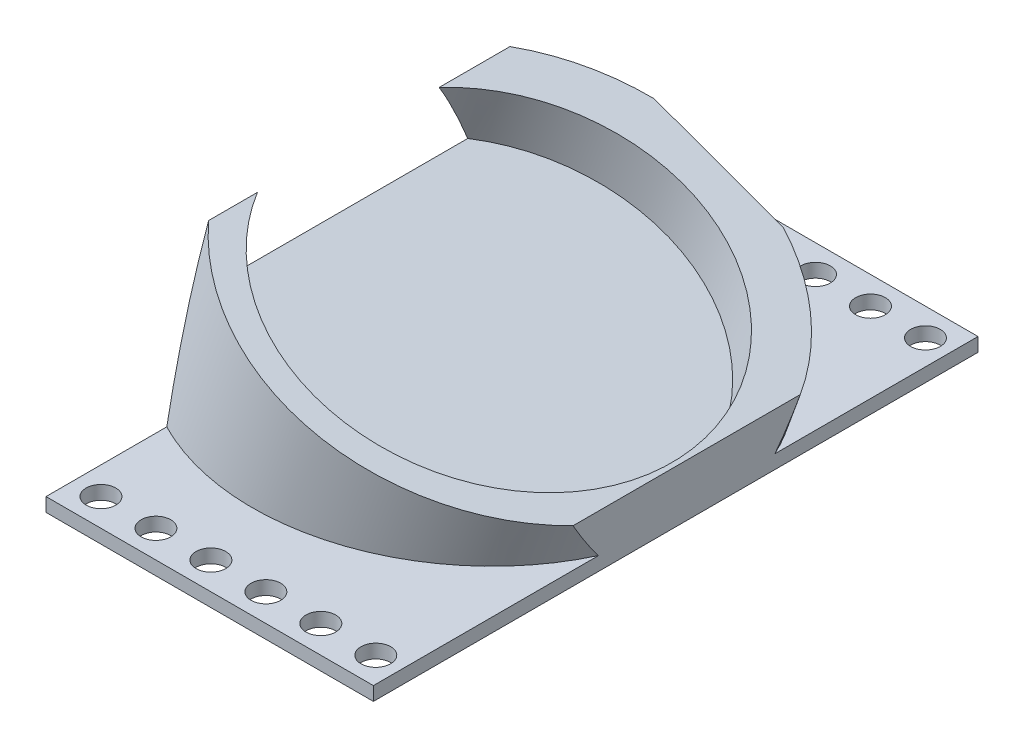
ISO-10303-21;
HEADER;
FILE_DESCRIPTION(('STEP AP214'),'2;1');
FILE_NAME('part.step','',(''),(''),'','','');
FILE_SCHEMA(('AUTOMOTIVE_DESIGN { 1 0 10303 214 1 1 1 1 }'));
ENDSEC;
DATA;
#1=APPLICATION_CONTEXT('core data for automotive mechanical design processes');
#2=APPLICATION_PROTOCOL_DEFINITION('international standard','automotive_design',2000,#1);
#3=PRODUCT_CONTEXT('',#1,'mechanical');
#4=PRODUCT('Part','Part','',(#3));
#5=PRODUCT_RELATED_PRODUCT_CATEGORY('part','',(#4));
#6=PRODUCT_DEFINITION_FORMATION('','',#4);
#7=PRODUCT_DEFINITION_CONTEXT('part definition',#1,'design');
#8=PRODUCT_DEFINITION('design','',#6,#7);
#9=PRODUCT_DEFINITION_SHAPE('','',#8);
#10=(LENGTH_UNIT() NAMED_UNIT(*) SI_UNIT(.MILLI.,.METRE.));
#11=(NAMED_UNIT(*) PLANE_ANGLE_UNIT() SI_UNIT($,.RADIAN.));
#12=(NAMED_UNIT(*) SI_UNIT($,.STERADIAN.) SOLID_ANGLE_UNIT());
#13=UNCERTAINTY_MEASURE_WITH_UNIT(LENGTH_MEASURE(1.E-05),#10,'distance_accuracy_value','');
#14=(GEOMETRIC_REPRESENTATION_CONTEXT(3) GLOBAL_UNCERTAINTY_ASSIGNED_CONTEXT((#13)) GLOBAL_UNIT_ASSIGNED_CONTEXT((#10,
#11,#12)) REPRESENTATION_CONTEXT('',''));
#15=CARTESIAN_POINT('',(0.,0.,0.));
#16=DIRECTION('',(0.,0.,1.));
#17=DIRECTION('',(1.,0.,0.));
#18=AXIS2_PLACEMENT_3D('',#15,#16,#17);
#19=CARTESIAN_POINT('',(0.,-58.42,0.));
#20=DIRECTION('',(0.,-1.,0.));
#21=DIRECTION('',(0.,0.,-1.));
#22=AXIS2_PLACEMENT_3D('',#19,#20,#21);
#23=PLANE('',#22);
#24=CARTESIAN_POINT('',(-38.9497353567698,-58.42,-63.5));
#25=DIRECTION('',(0.,-1.,0.));
#26=DIRECTION('',(0.,0.,-1.));
#27=AXIS2_PLACEMENT_3D('',#24,#25,#26);
#28=CIRCLE('',#27,3.42900000000001);
#29=CARTESIAN_POINT('',(-38.9497353567698,-58.42,-66.929));
#30=VERTEX_POINT('',#29);
#31=EDGE_CURVE('E133',#30,#30,#28,.T.);
#32=ORIENTED_EDGE('',*,*,#31,.F.);
#33=EDGE_LOOP('',(#32));
#34=FACE_BOUND('',#33,.T.);
#35=CARTESIAN_POINT('',(24.5502646432302,-58.42,-63.5));
#36=DIRECTION('',(0.,-1.,0.));
#37=DIRECTION('',(0.,0.,-1.));
#38=AXIS2_PLACEMENT_3D('',#35,#36,#37);
#39=CIRCLE('',#38,3.42900000000001);
#40=CARTESIAN_POINT('',(24.5502646432302,-58.42,-66.929));
#41=VERTEX_POINT('',#40);
#42=EDGE_CURVE('E290',#41,#41,#39,.T.);
#43=ORIENTED_EDGE('',*,*,#42,.F.);
#44=EDGE_LOOP('',(#43));
#45=FACE_BOUND('',#44,.T.);
#46=CARTESIAN_POINT('',(11.8502646432302,-58.42,-63.5));
#47=DIRECTION('',(0.,-1.,0.));
#48=DIRECTION('',(0.,0.,-1.));
#49=AXIS2_PLACEMENT_3D('',#46,#47,#48);
#50=CIRCLE('',#49,3.42900000000001);
#51=CARTESIAN_POINT('',(11.8502646432302,-58.42,-66.929));
#52=VERTEX_POINT('',#51);
#53=EDGE_CURVE('E296',#52,#52,#50,.T.);
#54=ORIENTED_EDGE('',*,*,#53,.F.);
#55=EDGE_LOOP('',(#54));
#56=FACE_BOUND('',#55,.T.);
#57=CARTESIAN_POINT('',(-0.849735356769764,-58.42,-63.5));
#58=DIRECTION('',(0.,-1.,0.));
#59=DIRECTION('',(0.,0.,-1.));
#60=AXIS2_PLACEMENT_3D('',#57,#58,#59);
#61=CIRCLE('',#60,3.42900000000001);
#62=CARTESIAN_POINT('',(-0.849735356769764,-58.42,-66.929));
#63=VERTEX_POINT('',#62);
#64=EDGE_CURVE('E302',#63,#63,#61,.T.);
#65=ORIENTED_EDGE('',*,*,#64,.F.);
#66=EDGE_LOOP('',(#65));
#67=FACE_BOUND('',#66,.T.);
#68=CARTESIAN_POINT('',(-13.5497353567698,-58.42,-63.5));
#69=DIRECTION('',(0.,-1.,0.));
#70=DIRECTION('',(0.,0.,-1.));
#71=AXIS2_PLACEMENT_3D('',#68,#69,#70);
#72=CIRCLE('',#71,3.42900000000001);
#73=CARTESIAN_POINT('',(-13.5497353567698,-58.42,-66.929));
#74=VERTEX_POINT('',#73);
#75=EDGE_CURVE('E308',#74,#74,#72,.T.);
#76=ORIENTED_EDGE('',*,*,#75,.F.);
#77=EDGE_LOOP('',(#76));
#78=FACE_BOUND('',#77,.T.);
#79=CARTESIAN_POINT('',(-26.2497353567698,-58.42,-63.5));
#80=DIRECTION('',(0.,-1.,0.));
#81=DIRECTION('',(0.,0.,-1.));
#82=AXIS2_PLACEMENT_3D('',#79,#80,#81);
#83=CIRCLE('',#82,3.42900000000002);
#84=CARTESIAN_POINT('',(-26.2497353567698,-58.42,-66.929));
#85=VERTEX_POINT('',#84);
#86=EDGE_CURVE('E314',#85,#85,#83,.T.);
#87=ORIENTED_EDGE('',*,*,#86,.F.);
#88=EDGE_LOOP('',(#87));
#89=FACE_BOUND('',#88,.T.);
#90=CARTESIAN_POINT('',(24.5502646432289,-58.42,63.5));
#91=DIRECTION('',(0.,-1.,0.));
#92=DIRECTION('',(0.,0.,-1.));
#93=AXIS2_PLACEMENT_3D('',#90,#91,#92);
#94=CIRCLE('',#93,3.42900000000001);
#95=CARTESIAN_POINT('',(24.5502646432289,-58.42,60.071));
#96=VERTEX_POINT('',#95);
#97=EDGE_CURVE('E320',#96,#96,#94,.T.);
#98=ORIENTED_EDGE('',*,*,#97,.F.);
#99=EDGE_LOOP('',(#98));
#100=FACE_BOUND('',#99,.T.);
#101=CARTESIAN_POINT('',(11.8502646432289,-58.42,63.5));
#102=DIRECTION('',(0.,-1.,0.));
#103=DIRECTION('',(0.,0.,-1.));
#104=AXIS2_PLACEMENT_3D('',#101,#102,#103);
#105=CIRCLE('',#104,3.42900000000001);
#106=CARTESIAN_POINT('',(11.8502646432289,-58.42,60.071));
#107=VERTEX_POINT('',#106);
#108=EDGE_CURVE('E326',#107,#107,#105,.T.);
#109=ORIENTED_EDGE('',*,*,#108,.F.);
#110=EDGE_LOOP('',(#109));
#111=FACE_BOUND('',#110,.T.);
#112=CARTESIAN_POINT('',(-0.849735356771096,-58.42,63.5));
#113=DIRECTION('',(0.,-1.,0.));
#114=DIRECTION('',(0.,0.,-1.));
#115=AXIS2_PLACEMENT_3D('',#112,#113,#114);
#116=CIRCLE('',#115,3.42900000000001);
#117=CARTESIAN_POINT('',(-0.849735356771096,-58.42,60.071));
#118=VERTEX_POINT('',#117);
#119=EDGE_CURVE('E332',#118,#118,#116,.T.);
#120=ORIENTED_EDGE('',*,*,#119,.F.);
#121=EDGE_LOOP('',(#120));
#122=FACE_BOUND('',#121,.T.);
#123=CARTESIAN_POINT('',(-13.5497353567711,-58.42,63.5));
#124=DIRECTION('',(0.,-1.,0.));
#125=DIRECTION('',(0.,0.,-1.));
#126=AXIS2_PLACEMENT_3D('',#123,#124,#125);
#127=CIRCLE('',#126,3.42900000000001);
#128=CARTESIAN_POINT('',(-13.5497353567711,-58.42,60.071));
#129=VERTEX_POINT('',#128);
#130=EDGE_CURVE('E338',#129,#129,#127,.T.);
#131=ORIENTED_EDGE('',*,*,#130,.F.);
#132=EDGE_LOOP('',(#131));
#133=FACE_BOUND('',#132,.T.);
#134=CARTESIAN_POINT('',(-26.2497353567711,-58.42,63.5));
#135=DIRECTION('',(0.,-1.,0.));
#136=DIRECTION('',(0.,0.,-1.));
#137=AXIS2_PLACEMENT_3D('',#134,#135,#136);
#138=CIRCLE('',#137,3.42900000000002);
#139=CARTESIAN_POINT('',(-26.2497353567711,-58.42,60.071));
#140=VERTEX_POINT('',#139);
#141=EDGE_CURVE('E344',#140,#140,#138,.T.);
#142=ORIENTED_EDGE('',*,*,#141,.F.);
#143=EDGE_LOOP('',(#142));
#144=FACE_BOUND('',#143,.T.);
#145=CARTESIAN_POINT('',(-38.9497353567711,-58.42,63.5));
#146=DIRECTION('',(0.,-1.,0.));
#147=DIRECTION('',(0.,0.,-1.));
#148=AXIS2_PLACEMENT_3D('',#145,#146,#147);
#149=CIRCLE('',#148,3.42900000000001);
#150=CARTESIAN_POINT('',(-38.9497353567711,-58.42,60.071));
#151=VERTEX_POINT('',#150);
#152=EDGE_CURVE('E226',#151,#151,#149,.T.);
#153=ORIENTED_EDGE('',*,*,#152,.F.);
#154=EDGE_LOOP('',(#153));
#155=FACE_BOUND('',#154,.T.);
#156=DIRECTION('',(1.,0.,0.));
#157=VECTOR('',#156,1.);
#158=CARTESIAN_POINT('',(45.2997353567711,-58.42,-69.85));
#159=LINE('',#158,#157);
#160=CARTESIAN_POINT('',(-45.2997353567711,-58.42,-69.85));
#161=VERTEX_POINT('',#160);
#162=CARTESIAN_POINT('',(30.3406109486266,-58.42,-69.85));
#163=VERTEX_POINT('',#162);
#164=EDGE_CURVE('E141',#161,#163,#159,.T.);
#165=ORIENTED_EDGE('',*,*,#164,.T.);
#166=DIRECTION('',(0.,0.,1.));
#167=VECTOR('',#166,1.);
#168=CARTESIAN_POINT('',(30.3406109486266,-58.42,69.85));
#169=LINE('',#168,#167);
#170=CARTESIAN_POINT('',(30.3406109486266,-58.42,69.85));
#171=VERTEX_POINT('',#170);
#172=EDGE_CURVE('E128',#163,#171,#169,.T.);
#173=ORIENTED_EDGE('',*,*,#172,.T.);
#174=DIRECTION('',(-1.,0.,0.));
#175=VECTOR('',#174,1.);
#176=CARTESIAN_POINT('',(45.2997353567711,-58.42,69.85));
#177=LINE('',#176,#175);
#178=CARTESIAN_POINT('',(-45.2997353567711,-58.42,69.85));
#179=VERTEX_POINT('',#178);
#180=EDGE_CURVE('E138',#171,#179,#177,.T.);
#181=ORIENTED_EDGE('',*,*,#180,.T.);
#182=DIRECTION('',(0.,0.,-1.));
#183=VECTOR('',#182,1.);
#184=CARTESIAN_POINT('',(-45.2997353567711,-58.42,50.8));
#185=LINE('',#184,#183);
#186=EDGE_CURVE('E186',#179,#161,#185,.T.);
#187=ORIENTED_EDGE('',*,*,#186,.T.);
#188=EDGE_LOOP('',(#165,#173,#181,#187));
#189=FACE_BOUND('',#188,.T.);
#190=ADVANCED_FACE('F36',(#34,#45,#56,#67,#78,#89,#100,#111,#122,#133,#144,#155,#189),#23,.T.);
#191=CARTESIAN_POINT('',(45.2997353567711,-55.245,69.85));
#192=DIRECTION('',(0.,0.,1.));
#193=DIRECTION('',(1.,0.,0.));
#194=AXIS2_PLACEMENT_3D('',#191,#192,#193);
#195=PLANE('',#194);
#196=ORIENTED_EDGE('',*,*,#180,.F.);
#197=DIRECTION('',(0.,-1.,0.));
#198=VECTOR('',#197,1.);
#199=CARTESIAN_POINT('',(30.3406109486266,-18.796994769083,69.85));
#200=LINE('',#199,#198);
#201=CARTESIAN_POINT('',(30.3406109486266,-55.245,69.85));
#202=VERTEX_POINT('',#201);
#203=EDGE_CURVE('E124',#202,#171,#200,.T.);
#204=ORIENTED_EDGE('',*,*,#203,.F.);
#205=DIRECTION('',(-1.,0.,0.));
#206=VECTOR('',#205,1.);
#207=CARTESIAN_POINT('',(45.2997353567711,-55.245,69.85));
#208=LINE('',#207,#206);
#209=CARTESIAN_POINT('',(-45.2997353567711,-55.245,69.85));
#210=VERTEX_POINT('',#209);
#211=EDGE_CURVE('E160',#202,#210,#208,.T.);
#212=ORIENTED_EDGE('',*,*,#211,.T.);
#213=DIRECTION('',(0.,-1.,0.));
#214=VECTOR('',#213,1.);
#215=CARTESIAN_POINT('',(-45.2997353567711,-55.245,69.85));
#216=LINE('',#215,#214);
#217=EDGE_CURVE('E146',#210,#179,#216,.T.);
#218=ORIENTED_EDGE('',*,*,#217,.T.);
#219=EDGE_LOOP('',(#196,#204,#212,#218));
#220=FACE_BOUND('',#219,.T.);
#221=ADVANCED_FACE('F144',(#220),#195,.T.);
#222=CARTESIAN_POINT('',(45.2997353567711,-55.245,-69.85));
#223=DIRECTION('',(0.,0.,-1.));
#224=DIRECTION('',(-1.,0.,0.));
#225=AXIS2_PLACEMENT_3D('',#222,#223,#224);
#226=PLANE('',#225);
#227=DIRECTION('',(1.,0.,0.));
#228=VECTOR('',#227,1.);
#229=CARTESIAN_POINT('',(45.2997353567711,-55.245,-69.85));
#230=LINE('',#229,#228);
#231=CARTESIAN_POINT('',(-45.2997353567711,-55.245,-69.85));
#232=VERTEX_POINT('',#231);
#233=CARTESIAN_POINT('',(30.3406109486266,-55.245,-69.85));
#234=VERTEX_POINT('',#233);
#235=EDGE_CURVE('E222',#232,#234,#230,.T.);
#236=ORIENTED_EDGE('',*,*,#235,.T.);
#237=DIRECTION('',(0.,-1.,0.));
#238=VECTOR('',#237,1.);
#239=CARTESIAN_POINT('',(30.3406109486266,-18.796994769083,-69.85));
#240=LINE('',#239,#238);
#241=EDGE_CURVE('E134',#234,#163,#240,.T.);
#242=ORIENTED_EDGE('',*,*,#241,.T.);
#243=ORIENTED_EDGE('',*,*,#164,.F.);
#244=DIRECTION('',(0.,-1.,0.));
#245=VECTOR('',#244,1.);
#246=CARTESIAN_POINT('',(-45.2997353567711,-55.245,-69.85));
#247=LINE('',#246,#245);
#248=EDGE_CURVE('E157',#232,#161,#247,.T.);
#249=ORIENTED_EDGE('',*,*,#248,.F.);
#250=EDGE_LOOP('',(#236,#242,#243,#249));
#251=FACE_BOUND('',#250,.T.);
#252=ADVANCED_FACE('F238',(#251),#226,.T.);
#253=CARTESIAN_POINT('',(0.,-55.245,0.));
#254=DIRECTION('',(0.,-1.,0.));
#255=DIRECTION('',(0.,0.,-1.));
#256=AXIS2_PLACEMENT_3D('',#253,#254,#255);
#257=PLANE('',#256);
#258=CARTESIAN_POINT('',(-26.2497353567698,-55.245,-63.5));
#259=DIRECTION('',(0.,-1.,0.));
#260=DIRECTION('',(0.,0.,-1.));
#261=AXIS2_PLACEMENT_3D('',#258,#259,#260);
#262=CIRCLE('',#261,3.42900000000002);
#263=CARTESIAN_POINT('',(-26.2497353567698,-55.245,-66.929));
#264=VERTEX_POINT('',#263);
#265=EDGE_CURVE('E317',#264,#264,#262,.T.);
#266=ORIENTED_EDGE('',*,*,#265,.T.);
#267=EDGE_LOOP('',(#266));
#268=FACE_BOUND('',#267,.T.);
#269=CARTESIAN_POINT('',(-13.5497353567698,-55.245,-63.5));
#270=DIRECTION('',(0.,-1.,0.));
#271=DIRECTION('',(0.,0.,-1.));
#272=AXIS2_PLACEMENT_3D('',#269,#270,#271);
#273=CIRCLE('',#272,3.42900000000001);
#274=CARTESIAN_POINT('',(-13.5497353567698,-55.245,-66.929));
#275=VERTEX_POINT('',#274);
#276=EDGE_CURVE('E311',#275,#275,#273,.T.);
#277=ORIENTED_EDGE('',*,*,#276,.T.);
#278=EDGE_LOOP('',(#277));
#279=FACE_BOUND('',#278,.T.);
#280=CARTESIAN_POINT('',(-0.849735356769764,-55.245,-63.5));
#281=DIRECTION('',(0.,-1.,0.));
#282=DIRECTION('',(0.,0.,-1.));
#283=AXIS2_PLACEMENT_3D('',#280,#281,#282);
#284=CIRCLE('',#283,3.42900000000001);
#285=CARTESIAN_POINT('',(-0.849735356769764,-55.245,-66.929));
#286=VERTEX_POINT('',#285);
#287=EDGE_CURVE('E305',#286,#286,#284,.T.);
#288=ORIENTED_EDGE('',*,*,#287,.T.);
#289=EDGE_LOOP('',(#288));
#290=FACE_BOUND('',#289,.T.);
#291=CARTESIAN_POINT('',(11.8502646432302,-55.245,-63.5));
#292=DIRECTION('',(0.,-1.,0.));
#293=DIRECTION('',(0.,0.,-1.));
#294=AXIS2_PLACEMENT_3D('',#291,#292,#293);
#295=CIRCLE('',#294,3.42900000000001);
#296=CARTESIAN_POINT('',(11.8502646432302,-55.245,-66.929));
#297=VERTEX_POINT('',#296);
#298=EDGE_CURVE('E299',#297,#297,#295,.T.);
#299=ORIENTED_EDGE('',*,*,#298,.T.);
#300=EDGE_LOOP('',(#299));
#301=FACE_BOUND('',#300,.T.);
#302=CARTESIAN_POINT('',(24.5502646432302,-55.245,-63.5));
#303=DIRECTION('',(0.,-1.,0.));
#304=DIRECTION('',(0.,0.,-1.));
#305=AXIS2_PLACEMENT_3D('',#302,#303,#304);
#306=CIRCLE('',#305,3.42900000000001);
#307=CARTESIAN_POINT('',(24.5502646432302,-55.245,-66.929));
#308=VERTEX_POINT('',#307);
#309=EDGE_CURVE('E293',#308,#308,#306,.T.);
#310=ORIENTED_EDGE('',*,*,#309,.T.);
#311=EDGE_LOOP('',(#310));
#312=FACE_BOUND('',#311,.T.);
#313=CARTESIAN_POINT('',(-38.9497353567698,-55.245,-63.5));
#314=DIRECTION('',(0.,-1.,0.));
#315=DIRECTION('',(0.,0.,-1.));
#316=AXIS2_PLACEMENT_3D('',#313,#314,#315);
#317=CIRCLE('',#316,3.42900000000001);
#318=CARTESIAN_POINT('',(-38.9497353567698,-55.245,-66.929));
#319=VERTEX_POINT('',#318);
#320=EDGE_CURVE('E287',#319,#319,#317,.T.);
#321=ORIENTED_EDGE('',*,*,#320,.T.);
#322=EDGE_LOOP('',(#321));
#323=FACE_BOUND('',#322,.T.);
#324=DIRECTION('',(0.,0.,1.));
#325=VECTOR('',#324,1.);
#326=CARTESIAN_POINT('',(30.3406109486266,-55.245,0.));
#327=LINE('',#326,#325);
#328=CARTESIAN_POINT('',(30.3406109486266,-55.245,-22.9102180003758));
#329=VERTEX_POINT('',#328);
#330=EDGE_CURVE('E12',#234,#329,#327,.T.);
#331=ORIENTED_EDGE('',*,*,#330,.F.);
#332=ORIENTED_EDGE('',*,*,#235,.F.);
#333=DIRECTION('',(0.,0.,-1.));
#334=VECTOR('',#333,1.);
#335=CARTESIAN_POINT('',(-45.2997353567711,-55.245,-69.85));
#336=LINE('',#335,#334);
#337=CARTESIAN_POINT('',(-45.2997353567711,-55.245,-47.0186145354893));
#338=VERTEX_POINT('',#337);
#339=EDGE_CURVE('E147',#338,#232,#336,.T.);
#340=ORIENTED_EDGE('',*,*,#339,.F.);
#341=CARTESIAN_POINT('',(-19.183051197,-55.245,-2.54000000000003));
#342=DIRECTION('',(0.,-1.,0.));
#343=DIRECTION('',(1.,0.,0.));
#344=AXIS2_PLACEMENT_3D('',#341,#342,#343);
#345=ELLIPSE('',#344,54.0602308417763,50.8);
#346=CARTESIAN_POINT('',(-36.0633528669926,-55.245,-50.8));
#347=VERTEX_POINT('',#346);
#348=EDGE_CURVE('E166',#347,#338,#345,.F.);
#349=ORIENTED_EDGE('',*,*,#348,.F.);
#350=DIRECTION('',(-1.,0.,0.));
#351=VECTOR('',#350,1.);
#352=CARTESIAN_POINT('',(0.,-55.245,-50.8));
#353=LINE('',#352,#351);
#354=CARTESIAN_POINT('',(-2.30274952700746,-55.245,-50.8));
#355=VERTEX_POINT('',#354);
#356=EDGE_CURVE('E163',#355,#347,#353,.T.);
#357=ORIENTED_EDGE('',*,*,#356,.F.);
#358=CARTESIAN_POINT('',(-19.183051197,-55.245,-2.54000000000003));
#359=DIRECTION('',(0.,-1.,0.));
#360=DIRECTION('',(1.,0.,0.));
#361=AXIS2_PLACEMENT_3D('',#358,#359,#360);
#362=ELLIPSE('',#361,54.0602308417763,50.8);
#363=EDGE_CURVE('E156',#329,#355,#362,.F.);
#364=ORIENTED_EDGE('',*,*,#363,.F.);
#365=EDGE_LOOP('',(#331,#332,#340,#349,#357,#364));
#366=FACE_BOUND('',#365,.T.);
#367=ADVANCED_FACE('F230',(#268,#279,#290,#301,#312,#323,#366),#257,.F.);
#368=CARTESIAN_POINT('',(-38.9497353567711,-55.245,63.5));
#369=DIRECTION('',(0.,-1.,0.));
#370=DIRECTION('',(0.,0.,-1.));
#371=AXIS2_PLACEMENT_3D('',#368,#369,#370);
#372=CIRCLE('',#371,3.42900000000001);
#373=CARTESIAN_POINT('',(-38.9497353567711,-55.245,60.071));
#374=VERTEX_POINT('',#373);
#375=EDGE_CURVE('E151',#374,#374,#372,.T.);
#376=ORIENTED_EDGE('',*,*,#375,.T.);
#377=EDGE_LOOP('',(#376));
#378=FACE_BOUND('',#377,.T.);
#379=CARTESIAN_POINT('',(-26.2497353567711,-55.245,63.5));
#380=DIRECTION('',(0.,-1.,0.));
#381=DIRECTION('',(0.,0.,-1.));
#382=AXIS2_PLACEMENT_3D('',#379,#380,#381);
#383=CIRCLE('',#382,3.42900000000002);
#384=CARTESIAN_POINT('',(-26.2497353567711,-55.245,60.071));
#385=VERTEX_POINT('',#384);
#386=EDGE_CURVE('E347',#385,#385,#383,.T.);
#387=ORIENTED_EDGE('',*,*,#386,.T.);
#388=EDGE_LOOP('',(#387));
#389=FACE_BOUND('',#388,.T.);
#390=CARTESIAN_POINT('',(-13.5497353567711,-55.245,63.5));
#391=DIRECTION('',(0.,-1.,0.));
#392=DIRECTION('',(0.,0.,-1.));
#393=AXIS2_PLACEMENT_3D('',#390,#391,#392);
#394=CIRCLE('',#393,3.42900000000001);
#395=CARTESIAN_POINT('',(-13.5497353567711,-55.245,60.071));
#396=VERTEX_POINT('',#395);
#397=EDGE_CURVE('E341',#396,#396,#394,.T.);
#398=ORIENTED_EDGE('',*,*,#397,.T.);
#399=EDGE_LOOP('',(#398));
#400=FACE_BOUND('',#399,.T.);
#401=CARTESIAN_POINT('',(-0.849735356771096,-55.245,63.5));
#402=DIRECTION('',(0.,-1.,0.));
#403=DIRECTION('',(0.,0.,-1.));
#404=AXIS2_PLACEMENT_3D('',#401,#402,#403);
#405=CIRCLE('',#404,3.42900000000001);
#406=CARTESIAN_POINT('',(-0.849735356771096,-55.245,60.071));
#407=VERTEX_POINT('',#406);
#408=EDGE_CURVE('E335',#407,#407,#405,.T.);
#409=ORIENTED_EDGE('',*,*,#408,.T.);
#410=EDGE_LOOP('',(#409));
#411=FACE_BOUND('',#410,.T.);
#412=CARTESIAN_POINT('',(11.8502646432289,-55.245,63.5));
#413=DIRECTION('',(0.,-1.,0.));
#414=DIRECTION('',(0.,0.,-1.));
#415=AXIS2_PLACEMENT_3D('',#412,#413,#414);
#416=CIRCLE('',#415,3.42900000000001);
#417=CARTESIAN_POINT('',(11.8502646432289,-55.245,60.071));
#418=VERTEX_POINT('',#417);
#419=EDGE_CURVE('E329',#418,#418,#416,.T.);
#420=ORIENTED_EDGE('',*,*,#419,.T.);
#421=EDGE_LOOP('',(#420));
#422=FACE_BOUND('',#421,.T.);
#423=CARTESIAN_POINT('',(24.5502646432289,-55.245,63.5));
#424=DIRECTION('',(0.,-1.,0.));
#425=DIRECTION('',(0.,0.,-1.));
#426=AXIS2_PLACEMENT_3D('',#423,#424,#425);
#427=CIRCLE('',#426,3.42900000000001);
#428=CARTESIAN_POINT('',(24.5502646432289,-55.245,60.071));
#429=VERTEX_POINT('',#428);
#430=EDGE_CURVE('E323',#429,#429,#427,.T.);
#431=ORIENTED_EDGE('',*,*,#430,.T.);
#432=EDGE_LOOP('',(#431));
#433=FACE_BOUND('',#432,.T.);
#434=CARTESIAN_POINT('',(30.3406109486266,-55.245,17.8302180003758));
#435=VERTEX_POINT('',#434);
#436=EDGE_CURVE('E40',#435,#202,#327,.T.);
#437=ORIENTED_EDGE('',*,*,#436,.F.);
#438=CARTESIAN_POINT('',(-19.183051197,-55.245,-2.54000000000003));
#439=DIRECTION('',(0.,-1.,0.));
#440=DIRECTION('',(1.,0.,0.));
#441=AXIS2_PLACEMENT_3D('',#438,#439,#440);
#442=ELLIPSE('',#441,54.0602308417763,50.8);
#443=CARTESIAN_POINT('',(-45.2997353567711,-55.245,41.9386145354892));
#444=VERTEX_POINT('',#443);
#445=EDGE_CURVE('E205',#444,#435,#442,.F.);
#446=ORIENTED_EDGE('',*,*,#445,.F.);
#447=EDGE_CURVE('E149',#210,#444,#336,.T.);
#448=ORIENTED_EDGE('',*,*,#447,.F.);
#449=ORIENTED_EDGE('',*,*,#211,.F.);
#450=EDGE_LOOP('',(#437,#446,#448,#449));
#451=FACE_BOUND('',#450,.T.);
#452=ADVANCED_FACE('F228',(#378,#389,#400,#411,#422,#433,#451),#257,.F.);
#453=CARTESIAN_POINT('',(0.,0.,-50.8));
#454=DIRECTION('',(0.,0.,-1.));
#455=DIRECTION('',(-1.,0.,0.));
#456=AXIS2_PLACEMENT_3D('',#453,#454,#455);
#457=PLANE('',#456);
#458=DIRECTION('',(0.342020143325666,0.93969262078591,0.));
#459=VECTOR('',#458,1.);
#460=CARTESIAN_POINT('',(-8.35286673938862,-71.8675604260712,-50.8));
#461=LINE('',#460,#459);
#462=CARTESIAN_POINT('',(4.38172167110047,-36.8795663222035,-50.8));
#463=VERTEX_POINT('',#462);
#464=EDGE_CURVE('E172',#463,#355,#461,.F.);
#465=ORIENTED_EDGE('',*,*,#464,.T.);
#466=ORIENTED_EDGE('',*,*,#356,.T.);
#467=DIRECTION('',(0.342020143325666,0.93969262078591,0.));
#468=VECTOR('',#467,1.);
#469=CARTESIAN_POINT('',(-38.164229701851,-61.017111664829,-50.8));
#470=LINE('',#469,#468);
#471=CARTESIAN_POINT('',(-25.4296412913619,-26.0291175609614,-50.8));
#472=VERTEX_POINT('',#471);
#473=EDGE_CURVE('E183',#347,#472,#470,.T.);
#474=ORIENTED_EDGE('',*,*,#473,.T.);
#475=DIRECTION('',(0.93969262078591,-0.342020143325666,0.));
#476=VECTOR('',#475,1.);
#477=CARTESIAN_POINT('',(-11.3403000744326,-31.1572183843436,-50.8));
#478=LINE('',#477,#476);
#479=EDGE_CURVE('E198',#472,#463,#478,.T.);
#480=ORIENTED_EDGE('',*,*,#479,.T.);
#481=EDGE_LOOP('',(#465,#466,#474,#480));
#482=FACE_BOUND('',#481,.T.);
#483=ADVANCED_FACE('F38',(#482),#457,.T.);
#484=CARTESIAN_POINT('',(30.3406109486266,0.,-50.8));
#485=DIRECTION('',(-1.,0.,0.));
#486=DIRECTION('',(0.,0.,1.));
#487=AXIS2_PLACEMENT_3D('',#484,#485,#486);
#488=PLANE('',#487);
#489=CARTESIAN_POINT('',(30.3406109486266,80.8201434738102,-2.54000000000003));
#490=DIRECTION('',(-1.,0.,0.));
#491=DIRECTION('',(0.,1.,0.));
#492=AXIS2_PLACEMENT_3D('',#489,#490,#491);
#493=ELLIPSE('',#492,148.529263528286,50.8);
#494=CARTESIAN_POINT('',(30.3406109486266,-46.327829333835,23.7184506301308));
#495=VERTEX_POINT('',#494);
#496=EDGE_CURVE('E173',#435,#495,#493,.T.);
#497=ORIENTED_EDGE('',*,*,#496,.F.);
#498=ORIENTED_EDGE('',*,*,#436,.T.);
#499=ORIENTED_EDGE('',*,*,#203,.T.);
#500=ORIENTED_EDGE('',*,*,#172,.F.);
#501=ORIENTED_EDGE('',*,*,#241,.F.);
#502=ORIENTED_EDGE('',*,*,#330,.T.);
#503=CARTESIAN_POINT('',(30.3406109486266,-46.327829333835,-28.7984506301309));
#504=VERTEX_POINT('',#503);
#505=EDGE_CURVE('E169',#504,#329,#493,.T.);
#506=ORIENTED_EDGE('',*,*,#505,.F.);
#507=DIRECTION('',(0.,0.,1.));
#508=VECTOR('',#507,1.);
#509=CARTESIAN_POINT('',(30.3406109486266,-46.327829333835,0.));
#510=LINE('',#509,#508);
#511=EDGE_CURVE('E203',#504,#495,#510,.T.);
#512=ORIENTED_EDGE('',*,*,#511,.T.);
#513=EDGE_LOOP('',(#497,#498,#499,#500,#501,#502,#506,#512));
#514=FACE_BOUND('',#513,.T.);
#515=ADVANCED_FACE('F127',(#514),#488,.F.);
#516=CARTESIAN_POINT('',(-23.2585482206198,-66.4423360454501,-2.54000000000003));
#517=DIRECTION('',(0.342020143325666,0.93969262078591,0.));
#518=DIRECTION('',(-0.93969262078591,0.342020143325666,0.));
#519=AXIS2_PLACEMENT_3D('',#516,#517,#518);
#520=CYLINDRICAL_SURFACE('',#519,50.8);
#521=ORIENTED_EDGE('',*,*,#505,.T.);
#522=ORIENTED_EDGE('',*,*,#363,.T.);
#523=ORIENTED_EDGE('',*,*,#464,.F.);
#524=CARTESIAN_POINT('',(-10.5239598101307,-31.4543419415824,-2.54000000000003));
#525=DIRECTION('',(0.342020143325666,0.93969262078591,0.));
#526=DIRECTION('',(-0.93969262078591,0.342020143325666,0.));
#527=AXIS2_PLACEMENT_3D('',#524,#525,#526);
#528=CIRCLE('',#527,50.8);
#529=EDGE_CURVE('E176',#504,#463,#528,.T.);
#530=ORIENTED_EDGE('',*,*,#529,.F.);
#531=EDGE_LOOP('',(#521,#522,#523,#530));
#532=FACE_BOUND('',#531,.T.);
#533=ADVANCED_FACE('F254',(#532),#520,.T.);
#534=ORIENTED_EDGE('',*,*,#473,.F.);
#535=ORIENTED_EDGE('',*,*,#348,.T.);
#536=CARTESIAN_POINT('',(-45.2997353567711,-127.,-2.54000000000003));
#537=DIRECTION('',(1.,0.,0.));
#538=DIRECTION('',(0.,1.,0.));
#539=AXIS2_PLACEMENT_3D('',#536,#537,#538);
#540=ELLIPSE('',#539,148.529263528286,50.8);
#541=CARTESIAN_POINT('',(-45.2997353567711,-18.796994769083,-37.340531571867));
#542=VERTEX_POINT('',#541);
#543=EDGE_CURVE('E179',#338,#542,#540,.T.);
#544=ORIENTED_EDGE('',*,*,#543,.T.);
#545=EDGE_CURVE('E181',#472,#542,#528,.T.);
#546=ORIENTED_EDGE('',*,*,#545,.F.);
#547=EDGE_LOOP('',(#534,#535,#544,#546));
#548=FACE_BOUND('',#547,.T.);
#549=ADVANCED_FACE('F278',(#548),#520,.T.);
#550=CARTESIAN_POINT('',(-45.2997353567711,-18.796994769083,32.260531571867));
#551=VERTEX_POINT('',#550);
#552=EDGE_CURVE('E184',#551,#444,#540,.T.);
#553=ORIENTED_EDGE('',*,*,#552,.T.);
#554=ORIENTED_EDGE('',*,*,#445,.T.);
#555=ORIENTED_EDGE('',*,*,#496,.T.);
#556=EDGE_CURVE('E180',#551,#495,#528,.T.);
#557=ORIENTED_EDGE('',*,*,#556,.F.);
#558=EDGE_LOOP('',(#553,#554,#555,#557));
#559=FACE_BOUND('',#558,.T.);
#560=ADVANCED_FACE('F209',(#559),#520,.T.);
#561=CARTESIAN_POINT('',(-45.2997353567711,0.,-50.8));
#562=DIRECTION('',(1.,0.,0.));
#563=DIRECTION('',(0.,1.,0.));
#564=AXIS2_PLACEMENT_3D('',#561,#562,#563);
#565=PLANE('',#564);
#566=ORIENTED_EDGE('',*,*,#186,.F.);
#567=ORIENTED_EDGE('',*,*,#217,.F.);
#568=ORIENTED_EDGE('',*,*,#447,.T.);
#569=ORIENTED_EDGE('',*,*,#552,.F.);
#570=DIRECTION('',(0.,0.,-1.));
#571=VECTOR('',#570,1.);
#572=CARTESIAN_POINT('',(-45.2997353567711,-18.796994769083,0.));
#573=LINE('',#572,#571);
#574=CARTESIAN_POINT('',(-45.2997353567711,-18.796994769083,20.9884259220293));
#575=VERTEX_POINT('',#574);
#576=EDGE_CURVE('E51',#551,#575,#573,.T.);
#577=ORIENTED_EDGE('',*,*,#576,.T.);
#578=CARTESIAN_POINT('',(-45.2997353567711,-127.,0.));
#579=DIRECTION('',(1.,0.,0.));
#580=DIRECTION('',(0.,-1.,0.));
#581=AXIS2_PLACEMENT_3D('',#578,#579,#580);
#582=ELLIPSE('',#581,124.39325820494,42.545);
#583=CARTESIAN_POINT('',(-45.2997353567711,-32.312052479527,27.59124485707));
#584=VERTEX_POINT('',#583);
#585=EDGE_CURVE('E201',#575,#584,#582,.T.);
#586=ORIENTED_EDGE('',*,*,#585,.T.);
#587=DIRECTION('',(0.,0.,-1.));
#588=VECTOR('',#587,1.);
#589=CARTESIAN_POINT('',(-45.2997353567711,-32.3120524795271,0.));
#590=LINE('',#589,#588);
#591=CARTESIAN_POINT('',(-45.2997353567711,-32.312052479527,-27.59124485707));
#592=VERTEX_POINT('',#591);
#593=EDGE_CURVE('E188',#584,#592,#590,.T.);
#594=ORIENTED_EDGE('',*,*,#593,.T.);
#595=CARTESIAN_POINT('',(-45.2997353567711,-18.796994769083,-20.9884259220293));
#596=VERTEX_POINT('',#595);
#597=EDGE_CURVE('E58',#592,#596,#582,.T.);
#598=ORIENTED_EDGE('',*,*,#597,.T.);
#599=EDGE_CURVE('E191',#596,#542,#573,.T.);
#600=ORIENTED_EDGE('',*,*,#599,.T.);
#601=ORIENTED_EDGE('',*,*,#543,.F.);
#602=ORIENTED_EDGE('',*,*,#339,.T.);
#603=ORIENTED_EDGE('',*,*,#248,.T.);
#604=EDGE_LOOP('',(#566,#567,#568,#569,#577,#586,#594,#598,#600,#601,#602,#603));
#605=FACE_BOUND('',#604,.T.);
#606=ADVANCED_FACE('F221',(#605),#565,.F.);
#607=CARTESIAN_POINT('',(-50.5031823614672,-16.903094943792,0.));
#608=DIRECTION('',(0.342020143325666,0.93969262078591,0.));
#609=DIRECTION('',(-0.93969262078591,0.342020143325666,0.));
#610=AXIS2_PLACEMENT_3D('',#607,#608,#609);
#611=PLANE('',#610);
#612=ORIENTED_EDGE('',*,*,#576,.F.);
#613=ORIENTED_EDGE('',*,*,#556,.T.);
#614=ORIENTED_EDGE('',*,*,#511,.F.);
#615=ORIENTED_EDGE('',*,*,#529,.T.);
#616=ORIENTED_EDGE('',*,*,#479,.F.);
#617=ORIENTED_EDGE('',*,*,#545,.T.);
#618=ORIENTED_EDGE('',*,*,#599,.F.);
#619=CARTESIAN_POINT('',(-10.5239598101307,-31.4543419415824,0.));
#620=DIRECTION('',(-0.342020143325666,-0.93969262078591,0.));
#621=DIRECTION('',(0.93969262078591,-0.342020143325666,0.));
#622=AXIS2_PLACEMENT_3D('',#619,#620,#621);
#623=CIRCLE('',#622,42.545);
#624=EDGE_CURVE('E192',#596,#575,#623,.T.);
#625=ORIENTED_EDGE('',*,*,#624,.T.);
#626=EDGE_LOOP('',(#612,#613,#614,#615,#616,#617,#618,#625));
#627=FACE_BOUND('',#626,.T.);
#628=ADVANCED_FACE('F220',(#627),#611,.T.);
#629=CARTESIAN_POINT('',(-14.8676156303667,-43.3884382255635,0.));
#630=DIRECTION('',(0.342020143325666,0.93969262078591,0.));
#631=DIRECTION('',(-0.93969262078591,0.342020143325666,0.));
#632=AXIS2_PLACEMENT_3D('',#629,#630,#631);
#633=PLANE('',#632);
#634=ORIENTED_EDGE('',*,*,#593,.F.);
#635=CARTESIAN_POINT('',(-14.8676156303667,-43.3884382255634,0.));
#636=DIRECTION('',(-0.342020143325666,-0.93969262078591,0.));
#637=DIRECTION('',(0.93969262078591,-0.342020143325666,0.));
#638=AXIS2_PLACEMENT_3D('',#635,#636,#637);
#639=CIRCLE('',#638,42.545);
#640=EDGE_CURVE('E195',#592,#584,#639,.T.);
#641=ORIENTED_EDGE('',*,*,#640,.F.);
#642=EDGE_LOOP('',(#634,#641));
#643=FACE_BOUND('',#642,.T.);
#644=ADVANCED_FACE('F262',(#643),#633,.T.);
#645=CARTESIAN_POINT('',(-60.4239624995393,-168.553472561459,0.));
#646=DIRECTION('',(-0.342020143325666,-0.93969262078591,0.));
#647=DIRECTION('',(0.93969262078591,-0.342020143325666,0.));
#648=AXIS2_PLACEMENT_3D('',#645,#646,#647);
#649=CYLINDRICAL_SURFACE('',#648,42.545);
#650=ORIENTED_EDGE('',*,*,#597,.F.);
#651=ORIENTED_EDGE('',*,*,#640,.T.);
#652=ORIENTED_EDGE('',*,*,#585,.F.);
#653=ORIENTED_EDGE('',*,*,#624,.F.);
#654=EDGE_LOOP('',(#650,#651,#652,#653));
#655=FACE_BOUND('',#654,.T.);
#656=ADVANCED_FACE('F263',(#655),#649,.F.);
#657=CARTESIAN_POINT('',(-38.9497353567711,-55.245,63.5));
#658=DIRECTION('',(0.,-1.,0.));
#659=DIRECTION('',(0.,0.,-1.));
#660=AXIS2_PLACEMENT_3D('',#657,#658,#659);
#661=CYLINDRICAL_SURFACE('',#660,3.42900000000001);
#662=ORIENTED_EDGE('',*,*,#375,.F.);
#663=EDGE_LOOP('',(#662));
#664=FACE_BOUND('',#663,.T.);
#665=ORIENTED_EDGE('',*,*,#152,.T.);
#666=EDGE_LOOP('',(#665));
#667=FACE_BOUND('',#666,.T.);
#668=ADVANCED_FACE('F265',(#664,#667),#661,.F.);
#669=CARTESIAN_POINT('',(-26.2497353567711,-55.245,63.5));
#670=DIRECTION('',(0.,-1.,0.));
#671=DIRECTION('',(0.,0.,-1.));
#672=AXIS2_PLACEMENT_3D('',#669,#670,#671);
#673=CYLINDRICAL_SURFACE('',#672,3.42900000000002);
#674=ORIENTED_EDGE('',*,*,#386,.F.);
#675=EDGE_LOOP('',(#674));
#676=FACE_BOUND('',#675,.T.);
#677=ORIENTED_EDGE('',*,*,#141,.T.);
#678=EDGE_LOOP('',(#677));
#679=FACE_BOUND('',#678,.T.);
#680=ADVANCED_FACE('F357',(#676,#679),#673,.F.);
#681=CARTESIAN_POINT('',(-13.5497353567711,-55.245,63.5));
#682=DIRECTION('',(0.,-1.,0.));
#683=DIRECTION('',(0.,0.,-1.));
#684=AXIS2_PLACEMENT_3D('',#681,#682,#683);
#685=CYLINDRICAL_SURFACE('',#684,3.42900000000001);
#686=ORIENTED_EDGE('',*,*,#397,.F.);
#687=EDGE_LOOP('',(#686));
#688=FACE_BOUND('',#687,.T.);
#689=ORIENTED_EDGE('',*,*,#130,.T.);
#690=EDGE_LOOP('',(#689));
#691=FACE_BOUND('',#690,.T.);
#692=ADVANCED_FACE('F362',(#688,#691),#685,.F.);
#693=CARTESIAN_POINT('',(-0.849735356771096,-55.245,63.5));
#694=DIRECTION('',(0.,-1.,0.));
#695=DIRECTION('',(0.,0.,-1.));
#696=AXIS2_PLACEMENT_3D('',#693,#694,#695);
#697=CYLINDRICAL_SURFACE('',#696,3.42900000000001);
#698=ORIENTED_EDGE('',*,*,#408,.F.);
#699=EDGE_LOOP('',(#698));
#700=FACE_BOUND('',#699,.T.);
#701=ORIENTED_EDGE('',*,*,#119,.T.);
#702=EDGE_LOOP('',(#701));
#703=FACE_BOUND('',#702,.T.);
#704=ADVANCED_FACE('F368',(#700,#703),#697,.F.);
#705=CARTESIAN_POINT('',(11.8502646432289,-55.245,63.5));
#706=DIRECTION('',(0.,-1.,0.));
#707=DIRECTION('',(0.,0.,-1.));
#708=AXIS2_PLACEMENT_3D('',#705,#706,#707);
#709=CYLINDRICAL_SURFACE('',#708,3.42900000000001);
#710=ORIENTED_EDGE('',*,*,#419,.F.);
#711=EDGE_LOOP('',(#710));
#712=FACE_BOUND('',#711,.T.);
#713=ORIENTED_EDGE('',*,*,#108,.T.);
#714=EDGE_LOOP('',(#713));
#715=FACE_BOUND('',#714,.T.);
#716=ADVANCED_FACE('F372',(#712,#715),#709,.F.);
#717=CARTESIAN_POINT('',(24.5502646432289,-55.245,63.5));
#718=DIRECTION('',(0.,-1.,0.));
#719=DIRECTION('',(0.,0.,-1.));
#720=AXIS2_PLACEMENT_3D('',#717,#718,#719);
#721=CYLINDRICAL_SURFACE('',#720,3.42900000000001);
#722=ORIENTED_EDGE('',*,*,#430,.F.);
#723=EDGE_LOOP('',(#722));
#724=FACE_BOUND('',#723,.T.);
#725=ORIENTED_EDGE('',*,*,#97,.T.);
#726=EDGE_LOOP('',(#725));
#727=FACE_BOUND('',#726,.T.);
#728=ADVANCED_FACE('F376',(#724,#727),#721,.F.);
#729=CARTESIAN_POINT('',(-26.2497353567698,-55.245,-63.5));
#730=DIRECTION('',(0.,-1.,0.));
#731=DIRECTION('',(0.,0.,-1.));
#732=AXIS2_PLACEMENT_3D('',#729,#730,#731);
#733=CYLINDRICAL_SURFACE('',#732,3.42900000000002);
#734=ORIENTED_EDGE('',*,*,#265,.F.);
#735=EDGE_LOOP('',(#734));
#736=FACE_BOUND('',#735,.T.);
#737=ORIENTED_EDGE('',*,*,#86,.T.);
#738=EDGE_LOOP('',(#737));
#739=FACE_BOUND('',#738,.T.);
#740=ADVANCED_FACE('F380',(#736,#739),#733,.F.);
#741=CARTESIAN_POINT('',(-13.5497353567698,-55.245,-63.5));
#742=DIRECTION('',(0.,-1.,0.));
#743=DIRECTION('',(0.,0.,-1.));
#744=AXIS2_PLACEMENT_3D('',#741,#742,#743);
#745=CYLINDRICAL_SURFACE('',#744,3.42900000000001);
#746=ORIENTED_EDGE('',*,*,#276,.F.);
#747=EDGE_LOOP('',(#746));
#748=FACE_BOUND('',#747,.T.);
#749=ORIENTED_EDGE('',*,*,#75,.T.);
#750=EDGE_LOOP('',(#749));
#751=FACE_BOUND('',#750,.T.);
#752=ADVANCED_FACE('F384',(#748,#751),#745,.F.);
#753=CARTESIAN_POINT('',(-0.849735356769764,-55.245,-63.5));
#754=DIRECTION('',(0.,-1.,0.));
#755=DIRECTION('',(0.,0.,-1.));
#756=AXIS2_PLACEMENT_3D('',#753,#754,#755);
#757=CYLINDRICAL_SURFACE('',#756,3.42900000000001);
#758=ORIENTED_EDGE('',*,*,#287,.F.);
#759=EDGE_LOOP('',(#758));
#760=FACE_BOUND('',#759,.T.);
#761=ORIENTED_EDGE('',*,*,#64,.T.);
#762=EDGE_LOOP('',(#761));
#763=FACE_BOUND('',#762,.T.);
#764=ADVANCED_FACE('F388',(#760,#763),#757,.F.);
#765=CARTESIAN_POINT('',(11.8502646432302,-55.245,-63.5));
#766=DIRECTION('',(0.,-1.,0.));
#767=DIRECTION('',(0.,0.,-1.));
#768=AXIS2_PLACEMENT_3D('',#765,#766,#767);
#769=CYLINDRICAL_SURFACE('',#768,3.42900000000001);
#770=ORIENTED_EDGE('',*,*,#298,.F.);
#771=EDGE_LOOP('',(#770));
#772=FACE_BOUND('',#771,.T.);
#773=ORIENTED_EDGE('',*,*,#53,.T.);
#774=EDGE_LOOP('',(#773));
#775=FACE_BOUND('',#774,.T.);
#776=ADVANCED_FACE('F392',(#772,#775),#769,.F.);
#777=CARTESIAN_POINT('',(24.5502646432302,-55.245,-63.5));
#778=DIRECTION('',(0.,-1.,0.));
#779=DIRECTION('',(0.,0.,-1.));
#780=AXIS2_PLACEMENT_3D('',#777,#778,#779);
#781=CYLINDRICAL_SURFACE('',#780,3.42900000000001);
#782=ORIENTED_EDGE('',*,*,#309,.F.);
#783=EDGE_LOOP('',(#782));
#784=FACE_BOUND('',#783,.T.);
#785=ORIENTED_EDGE('',*,*,#42,.T.);
#786=EDGE_LOOP('',(#785));
#787=FACE_BOUND('',#786,.T.);
#788=ADVANCED_FACE('F396',(#784,#787),#781,.F.);
#789=CARTESIAN_POINT('',(-38.9497353567698,-55.245,-63.5));
#790=DIRECTION('',(0.,-1.,0.));
#791=DIRECTION('',(0.,0.,-1.));
#792=AXIS2_PLACEMENT_3D('',#789,#790,#791);
#793=CYLINDRICAL_SURFACE('',#792,3.42900000000001);
#794=ORIENTED_EDGE('',*,*,#320,.F.);
#795=EDGE_LOOP('',(#794));
#796=FACE_BOUND('',#795,.T.);
#797=ORIENTED_EDGE('',*,*,#31,.T.);
#798=EDGE_LOOP('',(#797));
#799=FACE_BOUND('',#798,.T.);
#800=ADVANCED_FACE('F400',(#796,#799),#793,.F.);
#801=CLOSED_SHELL('',(#190,#221,#252,#367,#452,#483,#515,#533,#549,#560,#606,#628,#644,#656,
#668,#680,#692,#704,#716,#728,#740,#752,#764,#776,#788,#800));
#802=MANIFOLD_SOLID_BREP('B2',#801);
#803=ADVANCED_BREP_SHAPE_REPRESENTATION('',(#18,#802),#14);
#804=SHAPE_DEFINITION_REPRESENTATION(#9,#803);
ENDSEC;
END-ISO-10303-21;
